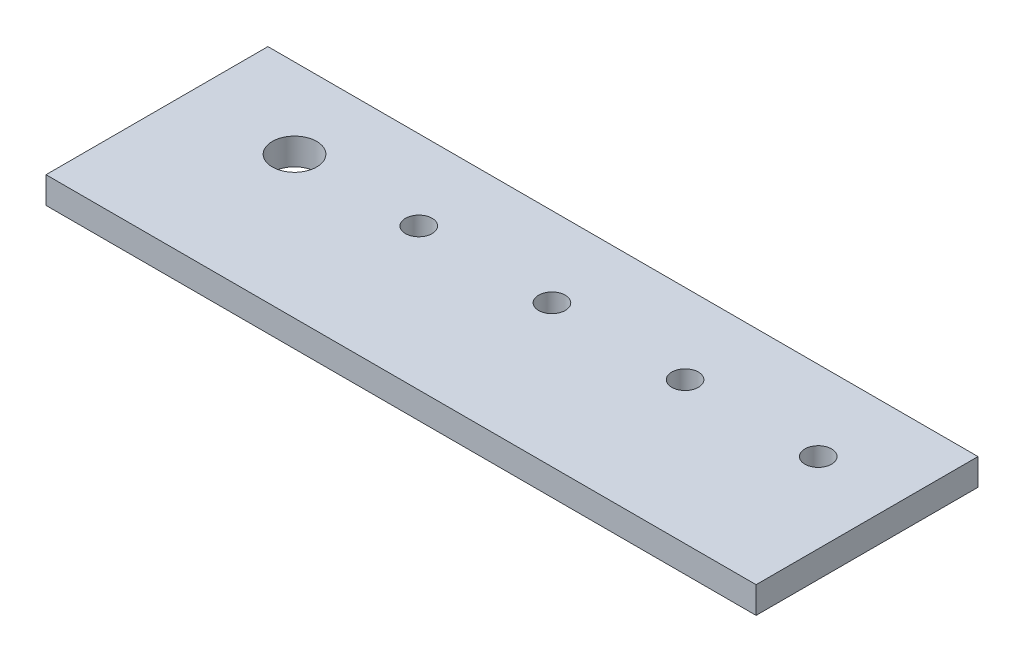
ISO-10303-21;
HEADER;
FILE_DESCRIPTION(('STEP AP214'),'2;1');
FILE_NAME('part.step','',(''),(''),'','','');
FILE_SCHEMA(('AUTOMOTIVE_DESIGN { 1 0 10303 214 1 1 1 1 }'));
ENDSEC;
DATA;
#1=APPLICATION_CONTEXT('core data for automotive mechanical design processes');
#2=APPLICATION_PROTOCOL_DEFINITION('international standard','automotive_design',2000,#1);
#3=PRODUCT_CONTEXT('',#1,'mechanical');
#4=PRODUCT('Part','Part','',(#3));
#5=PRODUCT_RELATED_PRODUCT_CATEGORY('part','',(#4));
#6=PRODUCT_DEFINITION_FORMATION('','',#4);
#7=PRODUCT_DEFINITION_CONTEXT('part definition',#1,'design');
#8=PRODUCT_DEFINITION('design','',#6,#7);
#9=PRODUCT_DEFINITION_SHAPE('','',#8);
#10=(LENGTH_UNIT() NAMED_UNIT(*) SI_UNIT(.MILLI.,.METRE.));
#11=(NAMED_UNIT(*) PLANE_ANGLE_UNIT() SI_UNIT($,.RADIAN.));
#12=(NAMED_UNIT(*) SI_UNIT($,.STERADIAN.) SOLID_ANGLE_UNIT());
#13=UNCERTAINTY_MEASURE_WITH_UNIT(LENGTH_MEASURE(1.E-05),#10,'distance_accuracy_value','');
#14=(GEOMETRIC_REPRESENTATION_CONTEXT(3) GLOBAL_UNCERTAINTY_ASSIGNED_CONTEXT((#13)) GLOBAL_UNIT_ASSIGNED_CONTEXT((#10,
#11,#12)) REPRESENTATION_CONTEXT('',''));
#15=CARTESIAN_POINT('',(0.,0.,0.));
#16=DIRECTION('',(0.,0.,1.));
#17=DIRECTION('',(1.,0.,0.));
#18=AXIS2_PLACEMENT_3D('',#15,#16,#17);
#19=CARTESIAN_POINT('',(0.,3.,0.));
#20=DIRECTION('',(1.,0.,0.));
#21=DIRECTION('',(0.,0.,-1.));
#22=AXIS2_PLACEMENT_3D('',#19,#20,#21);
#23=PLANE('',#22);
#24=DIRECTION('',(0.,0.,1.));
#25=VECTOR('',#24,1.);
#26=CARTESIAN_POINT('',(0.,0.,0.));
#27=LINE('',#26,#25);
#28=CARTESIAN_POINT('',(0.,0.,0.));
#29=VERTEX_POINT('',#28);
#30=CARTESIAN_POINT('',(0.,0.,25.));
#31=VERTEX_POINT('',#30);
#32=EDGE_CURVE('E96',#29,#31,#27,.T.);
#33=ORIENTED_EDGE('',*,*,#32,.T.);
#34=DIRECTION('',(0.,-1.,0.));
#35=VECTOR('',#34,1.);
#36=CARTESIAN_POINT('',(0.,3.,25.));
#37=LINE('',#36,#35);
#38=CARTESIAN_POINT('',(0.,3.,25.));
#39=VERTEX_POINT('',#38);
#40=EDGE_CURVE('E11',#39,#31,#37,.T.);
#41=ORIENTED_EDGE('',*,*,#40,.F.);
#42=DIRECTION('',(0.,0.,1.));
#43=VECTOR('',#42,1.);
#44=CARTESIAN_POINT('',(0.,3.,0.));
#45=LINE('',#44,#43);
#46=CARTESIAN_POINT('',(0.,3.,0.));
#47=VERTEX_POINT('',#46);
#48=EDGE_CURVE('E84',#47,#39,#45,.T.);
#49=ORIENTED_EDGE('',*,*,#48,.F.);
#50=DIRECTION('',(0.,-1.,0.));
#51=VECTOR('',#50,1.);
#52=CARTESIAN_POINT('',(0.,3.,0.));
#53=LINE('',#52,#51);
#54=EDGE_CURVE('E92',#47,#29,#53,.T.);
#55=ORIENTED_EDGE('',*,*,#54,.T.);
#56=EDGE_LOOP('',(#33,#41,#49,#55));
#57=FACE_BOUND('',#56,.T.);
#58=ADVANCED_FACE('F33',(#57),#23,.F.);
#59=CARTESIAN_POINT('',(0.,3.,25.));
#60=DIRECTION('',(0.,0.,-1.));
#61=DIRECTION('',(-1.,0.,0.));
#62=AXIS2_PLACEMENT_3D('',#59,#60,#61);
#63=PLANE('',#62);
#64=DIRECTION('',(1.,0.,0.));
#65=VECTOR('',#64,1.);
#66=CARTESIAN_POINT('',(0.,0.,25.));
#67=LINE('',#66,#65);
#68=CARTESIAN_POINT('',(80.,0.,25.));
#69=VERTEX_POINT('',#68);
#70=EDGE_CURVE('E88',#31,#69,#67,.T.);
#71=ORIENTED_EDGE('',*,*,#70,.T.);
#72=DIRECTION('',(0.,-1.,0.));
#73=VECTOR('',#72,1.);
#74=CARTESIAN_POINT('',(80.,3.,25.));
#75=LINE('',#74,#73);
#76=CARTESIAN_POINT('',(80.,3.,25.));
#77=VERTEX_POINT('',#76);
#78=EDGE_CURVE('E41',#77,#69,#75,.T.);
#79=ORIENTED_EDGE('',*,*,#78,.F.);
#80=DIRECTION('',(1.,0.,0.));
#81=VECTOR('',#80,1.);
#82=CARTESIAN_POINT('',(0.,3.,25.));
#83=LINE('',#82,#81);
#84=EDGE_CURVE('E79',#39,#77,#83,.T.);
#85=ORIENTED_EDGE('',*,*,#84,.F.);
#86=ORIENTED_EDGE('',*,*,#40,.T.);
#87=EDGE_LOOP('',(#71,#79,#85,#86));
#88=FACE_BOUND('',#87,.T.);
#89=ADVANCED_FACE('F87',(#88),#63,.F.);
#90=CARTESIAN_POINT('',(80.,3.,0.));
#91=DIRECTION('',(-1.,0.,0.));
#92=DIRECTION('',(0.,0.,1.));
#93=AXIS2_PLACEMENT_3D('',#90,#91,#92);
#94=PLANE('',#93);
#95=DIRECTION('',(0.,0.,-1.));
#96=VECTOR('',#95,1.);
#97=CARTESIAN_POINT('',(80.,0.,0.));
#98=LINE('',#97,#96);
#99=CARTESIAN_POINT('',(80.,0.,0.));
#100=VERTEX_POINT('',#99);
#101=EDGE_CURVE('E66',#69,#100,#98,.T.);
#102=ORIENTED_EDGE('',*,*,#101,.T.);
#103=DIRECTION('',(0.,-1.,0.));
#104=VECTOR('',#103,1.);
#105=CARTESIAN_POINT('',(80.,3.,0.));
#106=LINE('',#105,#104);
#107=CARTESIAN_POINT('',(80.,3.,0.));
#108=VERTEX_POINT('',#107);
#109=EDGE_CURVE('E89',#108,#100,#106,.T.);
#110=ORIENTED_EDGE('',*,*,#109,.F.);
#111=DIRECTION('',(0.,0.,-1.));
#112=VECTOR('',#111,1.);
#113=CARTESIAN_POINT('',(80.,3.,0.));
#114=LINE('',#113,#112);
#115=EDGE_CURVE('E82',#77,#108,#114,.T.);
#116=ORIENTED_EDGE('',*,*,#115,.F.);
#117=ORIENTED_EDGE('',*,*,#78,.T.);
#118=EDGE_LOOP('',(#102,#110,#116,#117));
#119=FACE_BOUND('',#118,.T.);
#120=ADVANCED_FACE('F90',(#119),#94,.F.);
#121=CARTESIAN_POINT('',(0.,3.,0.));
#122=DIRECTION('',(0.,0.,1.));
#123=DIRECTION('',(1.,0.,0.));
#124=AXIS2_PLACEMENT_3D('',#121,#122,#123);
#125=PLANE('',#124);
#126=DIRECTION('',(-1.,0.,0.));
#127=VECTOR('',#126,1.);
#128=CARTESIAN_POINT('',(0.,0.,0.));
#129=LINE('',#128,#127);
#130=EDGE_CURVE('E72',#100,#29,#129,.T.);
#131=ORIENTED_EDGE('',*,*,#130,.T.);
#132=ORIENTED_EDGE('',*,*,#54,.F.);
#133=DIRECTION('',(-1.,0.,0.));
#134=VECTOR('',#133,1.);
#135=CARTESIAN_POINT('',(0.,3.,0.));
#136=LINE('',#135,#134);
#137=EDGE_CURVE('E49',#108,#47,#136,.T.);
#138=ORIENTED_EDGE('',*,*,#137,.F.);
#139=ORIENTED_EDGE('',*,*,#109,.T.);
#140=EDGE_LOOP('',(#131,#132,#138,#139));
#141=FACE_BOUND('',#140,.T.);
#142=ADVANCED_FACE('F104',(#141),#125,.F.);
#143=CARTESIAN_POINT('',(0.,3.,0.));
#144=DIRECTION('',(0.,1.,0.));
#145=DIRECTION('',(0.,0.,1.));
#146=AXIS2_PLACEMENT_3D('',#143,#144,#145);
#147=PLANE('',#146);
#148=CARTESIAN_POINT('',(12.,3.,9.));
#149=DIRECTION('',(0.,1.,0.));
#150=DIRECTION('',(0.,0.,1.));
#151=AXIS2_PLACEMENT_3D('',#148,#149,#150);
#152=CIRCLE('',#151,2.5);
#153=CARTESIAN_POINT('',(12.,3.,11.5));
#154=VERTEX_POINT('',#153);
#155=EDGE_CURVE('E136',#154,#154,#152,.T.);
#156=ORIENTED_EDGE('',*,*,#155,.F.);
#157=EDGE_LOOP('',(#156));
#158=FACE_BOUND('',#157,.T.);
#159=CARTESIAN_POINT('',(71.,3.,9.));
#160=DIRECTION('',(0.,1.,0.));
#161=DIRECTION('',(0.,0.,1.));
#162=AXIS2_PLACEMENT_3D('',#159,#160,#161);
#163=CIRCLE('',#162,1.49999999999999);
#164=CARTESIAN_POINT('',(71.,3.,10.5));
#165=VERTEX_POINT('',#164);
#166=EDGE_CURVE('E130',#165,#165,#163,.T.);
#167=ORIENTED_EDGE('',*,*,#166,.F.);
#168=EDGE_LOOP('',(#167));
#169=FACE_BOUND('',#168,.T.);
#170=CARTESIAN_POINT('',(56.,3.,9.));
#171=DIRECTION('',(0.,1.,0.));
#172=DIRECTION('',(0.,0.,1.));
#173=AXIS2_PLACEMENT_3D('',#170,#171,#172);
#174=CIRCLE('',#173,1.49999999999999);
#175=CARTESIAN_POINT('',(56.,3.,10.5));
#176=VERTEX_POINT('',#175);
#177=EDGE_CURVE('E124',#176,#176,#174,.T.);
#178=ORIENTED_EDGE('',*,*,#177,.F.);
#179=EDGE_LOOP('',(#178));
#180=FACE_BOUND('',#179,.T.);
#181=CARTESIAN_POINT('',(41.,3.,9.));
#182=DIRECTION('',(0.,1.,0.));
#183=DIRECTION('',(0.,0.,1.));
#184=AXIS2_PLACEMENT_3D('',#181,#182,#183);
#185=CIRCLE('',#184,1.49999999999999);
#186=CARTESIAN_POINT('',(41.,3.,10.5));
#187=VERTEX_POINT('',#186);
#188=EDGE_CURVE('E118',#187,#187,#185,.T.);
#189=ORIENTED_EDGE('',*,*,#188,.F.);
#190=EDGE_LOOP('',(#189));
#191=FACE_BOUND('',#190,.T.);
#192=CARTESIAN_POINT('',(26.,3.,9.));
#193=DIRECTION('',(0.,1.,0.));
#194=DIRECTION('',(0.,0.,1.));
#195=AXIS2_PLACEMENT_3D('',#192,#193,#194);
#196=CIRCLE('',#195,1.49999999999999);
#197=CARTESIAN_POINT('',(26.,3.,10.5));
#198=VERTEX_POINT('',#197);
#199=EDGE_CURVE('E112',#198,#198,#196,.T.);
#200=ORIENTED_EDGE('',*,*,#199,.F.);
#201=EDGE_LOOP('',(#200));
#202=FACE_BOUND('',#201,.T.);
#203=ORIENTED_EDGE('',*,*,#48,.T.);
#204=ORIENTED_EDGE('',*,*,#84,.T.);
#205=ORIENTED_EDGE('',*,*,#115,.T.);
#206=ORIENTED_EDGE('',*,*,#137,.T.);
#207=EDGE_LOOP('',(#203,#204,#205,#206));
#208=FACE_BOUND('',#207,.T.);
#209=ADVANCED_FACE('F80',(#158,#169,#180,#191,#202,#208),#147,.T.);
#210=CARTESIAN_POINT('',(0.,0.,0.));
#211=DIRECTION('',(0.,1.,0.));
#212=DIRECTION('',(0.,0.,1.));
#213=AXIS2_PLACEMENT_3D('',#210,#211,#212);
#214=PLANE('',#213);
#215=CARTESIAN_POINT('',(12.,0.,9.));
#216=DIRECTION('',(0.,1.,0.));
#217=DIRECTION('',(0.,0.,1.));
#218=AXIS2_PLACEMENT_3D('',#215,#216,#217);
#219=CIRCLE('',#218,2.5);
#220=CARTESIAN_POINT('',(12.,0.,11.5));
#221=VERTEX_POINT('',#220);
#222=EDGE_CURVE('E133',#221,#221,#219,.T.);
#223=ORIENTED_EDGE('',*,*,#222,.T.);
#224=EDGE_LOOP('',(#223));
#225=FACE_BOUND('',#224,.T.);
#226=CARTESIAN_POINT('',(71.,0.,9.));
#227=DIRECTION('',(0.,1.,0.));
#228=DIRECTION('',(0.,0.,1.));
#229=AXIS2_PLACEMENT_3D('',#226,#227,#228);
#230=CIRCLE('',#229,1.49999999999999);
#231=CARTESIAN_POINT('',(71.,0.,10.5));
#232=VERTEX_POINT('',#231);
#233=EDGE_CURVE('E127',#232,#232,#230,.T.);
#234=ORIENTED_EDGE('',*,*,#233,.T.);
#235=EDGE_LOOP('',(#234));
#236=FACE_BOUND('',#235,.T.);
#237=CARTESIAN_POINT('',(56.,0.,9.));
#238=DIRECTION('',(0.,1.,0.));
#239=DIRECTION('',(0.,0.,1.));
#240=AXIS2_PLACEMENT_3D('',#237,#238,#239);
#241=CIRCLE('',#240,1.49999999999999);
#242=CARTESIAN_POINT('',(56.,0.,10.5));
#243=VERTEX_POINT('',#242);
#244=EDGE_CURVE('E121',#243,#243,#241,.T.);
#245=ORIENTED_EDGE('',*,*,#244,.T.);
#246=EDGE_LOOP('',(#245));
#247=FACE_BOUND('',#246,.T.);
#248=CARTESIAN_POINT('',(41.,0.,9.));
#249=DIRECTION('',(0.,1.,0.));
#250=DIRECTION('',(0.,0.,1.));
#251=AXIS2_PLACEMENT_3D('',#248,#249,#250);
#252=CIRCLE('',#251,1.49999999999999);
#253=CARTESIAN_POINT('',(41.,0.,10.5));
#254=VERTEX_POINT('',#253);
#255=EDGE_CURVE('E115',#254,#254,#252,.T.);
#256=ORIENTED_EDGE('',*,*,#255,.T.);
#257=EDGE_LOOP('',(#256));
#258=FACE_BOUND('',#257,.T.);
#259=CARTESIAN_POINT('',(26.,0.,9.));
#260=DIRECTION('',(0.,1.,0.));
#261=DIRECTION('',(0.,0.,1.));
#262=AXIS2_PLACEMENT_3D('',#259,#260,#261);
#263=CIRCLE('',#262,1.49999999999999);
#264=CARTESIAN_POINT('',(26.,0.,10.5));
#265=VERTEX_POINT('',#264);
#266=EDGE_CURVE('E99',#265,#265,#263,.T.);
#267=ORIENTED_EDGE('',*,*,#266,.T.);
#268=EDGE_LOOP('',(#267));
#269=FACE_BOUND('',#268,.T.);
#270=ORIENTED_EDGE('',*,*,#32,.F.);
#271=ORIENTED_EDGE('',*,*,#130,.F.);
#272=ORIENTED_EDGE('',*,*,#101,.F.);
#273=ORIENTED_EDGE('',*,*,#70,.F.);
#274=EDGE_LOOP('',(#270,#271,#272,#273));
#275=FACE_BOUND('',#274,.T.);
#276=ADVANCED_FACE('F107',(#225,#236,#247,#258,#269,#275),#214,.F.);
#277=CARTESIAN_POINT('',(26.,3.,9.));
#278=DIRECTION('',(0.,1.,0.));
#279=DIRECTION('',(0.,0.,1.));
#280=AXIS2_PLACEMENT_3D('',#277,#278,#279);
#281=CYLINDRICAL_SURFACE('',#280,1.49999999999999);
#282=ORIENTED_EDGE('',*,*,#266,.F.);
#283=EDGE_LOOP('',(#282));
#284=FACE_BOUND('',#283,.T.);
#285=ORIENTED_EDGE('',*,*,#199,.T.);
#286=EDGE_LOOP('',(#285));
#287=FACE_BOUND('',#286,.T.);
#288=ADVANCED_FACE('F153',(#284,#287),#281,.F.);
#289=CARTESIAN_POINT('',(41.,3.,9.));
#290=DIRECTION('',(0.,1.,0.));
#291=DIRECTION('',(0.,0.,1.));
#292=AXIS2_PLACEMENT_3D('',#289,#290,#291);
#293=CYLINDRICAL_SURFACE('',#292,1.49999999999999);
#294=ORIENTED_EDGE('',*,*,#255,.F.);
#295=EDGE_LOOP('',(#294));
#296=FACE_BOUND('',#295,.T.);
#297=ORIENTED_EDGE('',*,*,#188,.T.);
#298=EDGE_LOOP('',(#297));
#299=FACE_BOUND('',#298,.T.);
#300=ADVANCED_FACE('F155',(#296,#299),#293,.F.);
#301=CARTESIAN_POINT('',(56.,3.,9.));
#302=DIRECTION('',(0.,1.,0.));
#303=DIRECTION('',(0.,0.,1.));
#304=AXIS2_PLACEMENT_3D('',#301,#302,#303);
#305=CYLINDRICAL_SURFACE('',#304,1.49999999999999);
#306=ORIENTED_EDGE('',*,*,#244,.F.);
#307=EDGE_LOOP('',(#306));
#308=FACE_BOUND('',#307,.T.);
#309=ORIENTED_EDGE('',*,*,#177,.T.);
#310=EDGE_LOOP('',(#309));
#311=FACE_BOUND('',#310,.T.);
#312=ADVANCED_FACE('F162',(#308,#311),#305,.F.);
#313=CARTESIAN_POINT('',(71.,3.,9.));
#314=DIRECTION('',(0.,1.,0.));
#315=DIRECTION('',(0.,0.,1.));
#316=AXIS2_PLACEMENT_3D('',#313,#314,#315);
#317=CYLINDRICAL_SURFACE('',#316,1.49999999999999);
#318=ORIENTED_EDGE('',*,*,#233,.F.);
#319=EDGE_LOOP('',(#318));
#320=FACE_BOUND('',#319,.T.);
#321=ORIENTED_EDGE('',*,*,#166,.T.);
#322=EDGE_LOOP('',(#321));
#323=FACE_BOUND('',#322,.T.);
#324=ADVANCED_FACE('F200',(#320,#323),#317,.F.);
#325=CARTESIAN_POINT('',(12.,3.,9.));
#326=DIRECTION('',(0.,1.,0.));
#327=DIRECTION('',(0.,0.,1.));
#328=AXIS2_PLACEMENT_3D('',#325,#326,#327);
#329=CYLINDRICAL_SURFACE('',#328,2.5);
#330=ORIENTED_EDGE('',*,*,#222,.F.);
#331=EDGE_LOOP('',(#330));
#332=FACE_BOUND('',#331,.T.);
#333=ORIENTED_EDGE('',*,*,#155,.T.);
#334=EDGE_LOOP('',(#333));
#335=FACE_BOUND('',#334,.T.);
#336=ADVANCED_FACE('F140',(#332,#335),#329,.F.);
#337=CLOSED_SHELL('',(#58,#89,#120,#142,#209,#276,#288,#300,#312,#324,#336));
#338=MANIFOLD_SOLID_BREP('B2',#337);
#339=ADVANCED_BREP_SHAPE_REPRESENTATION('',(#18,#338),#14);
#340=SHAPE_DEFINITION_REPRESENTATION(#9,#339);
ENDSEC;
END-ISO-10303-21;
